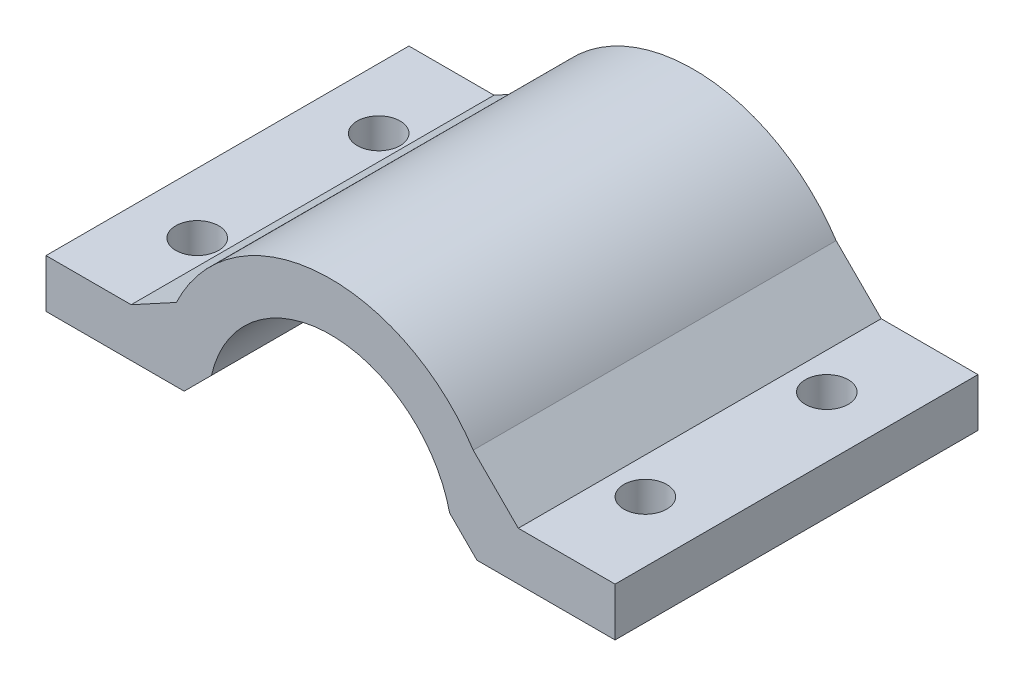
ISO-10303-21;
HEADER;
FILE_DESCRIPTION(('STEP AP214'),'2;1');
FILE_NAME('part.step','',(''),(''),'','','');
FILE_SCHEMA(('AUTOMOTIVE_DESIGN { 1 0 10303 214 1 1 1 1 }'));
ENDSEC;
DATA;
#1=APPLICATION_CONTEXT('core data for automotive mechanical design processes');
#2=APPLICATION_PROTOCOL_DEFINITION('international standard','automotive_design',2000,#1);
#3=PRODUCT_CONTEXT('',#1,'mechanical');
#4=PRODUCT('Part','Part','',(#3));
#5=PRODUCT_RELATED_PRODUCT_CATEGORY('part','',(#4));
#6=PRODUCT_DEFINITION_FORMATION('','',#4);
#7=PRODUCT_DEFINITION_CONTEXT('part definition',#1,'design');
#8=PRODUCT_DEFINITION('design','',#6,#7);
#9=PRODUCT_DEFINITION_SHAPE('','',#8);
#10=(LENGTH_UNIT() NAMED_UNIT(*) SI_UNIT(.MILLI.,.METRE.));
#11=(NAMED_UNIT(*) PLANE_ANGLE_UNIT() SI_UNIT($,.RADIAN.));
#12=(NAMED_UNIT(*) SI_UNIT($,.STERADIAN.) SOLID_ANGLE_UNIT());
#13=UNCERTAINTY_MEASURE_WITH_UNIT(LENGTH_MEASURE(1.E-05),#10,'distance_accuracy_value','');
#14=(GEOMETRIC_REPRESENTATION_CONTEXT(3) GLOBAL_UNCERTAINTY_ASSIGNED_CONTEXT((#13)) GLOBAL_UNIT_ASSIGNED_CONTEXT((#10,
#11,#12)) REPRESENTATION_CONTEXT('',''));
#15=CARTESIAN_POINT('',(0.,0.,0.));
#16=DIRECTION('',(0.,0.,1.));
#17=DIRECTION('',(1.,0.,0.));
#18=AXIS2_PLACEMENT_3D('',#15,#16,#17);
#19=CARTESIAN_POINT('',(0.,0.,38.1));
#20=DIRECTION('',(0.,1.,0.));
#21=DIRECTION('',(0.,0.,1.));
#22=AXIS2_PLACEMENT_3D('',#19,#20,#21);
#23=PLANE('',#22);
#24=CARTESIAN_POINT('',(6.35,0.,9.525));
#25=DIRECTION('',(0.,1.,0.));
#26=DIRECTION('',(0.,0.,1.));
#27=AXIS2_PLACEMENT_3D('',#24,#25,#26);
#28=CIRCLE('',#27,2.25);
#29=CARTESIAN_POINT('',(6.35,0.,11.775));
#30=VERTEX_POINT('',#29);
#31=EDGE_CURVE('E464',#30,#30,#28,.T.);
#32=ORIENTED_EDGE('',*,*,#31,.T.);
#33=EDGE_LOOP('',(#32));
#34=FACE_BOUND('',#33,.T.);
#35=DIRECTION('',(1.,0.,0.));
#36=VECTOR('',#35,1.);
#37=CARTESIAN_POINT('',(0.,0.,0.));
#38=LINE('',#37,#36);
#39=CARTESIAN_POINT('',(0.,0.,0.));
#40=VERTEX_POINT('',#39);
#41=CARTESIAN_POINT('',(14.5043205374543,0.,0.));
#42=VERTEX_POINT('',#41);
#43=EDGE_CURVE('E176',#40,#42,#38,.T.);
#44=ORIENTED_EDGE('',*,*,#43,.T.);
#45=DIRECTION('',(0.,0.,1.));
#46=VECTOR('',#45,1.);
#47=CARTESIAN_POINT('',(14.5043205374543,0.,38.1));
#48=LINE('',#47,#46);
#49=CARTESIAN_POINT('',(14.5043205374543,0.,38.1));
#50=VERTEX_POINT('',#49);
#51=EDGE_CURVE('E67',#42,#50,#48,.T.);
#52=ORIENTED_EDGE('',*,*,#51,.T.);
#53=DIRECTION('',(1.,0.,0.));
#54=VECTOR('',#53,1.);
#55=CARTESIAN_POINT('',(0.,0.,38.1));
#56=LINE('',#55,#54);
#57=CARTESIAN_POINT('',(0.,0.,38.1));
#58=VERTEX_POINT('',#57);
#59=EDGE_CURVE('E161',#58,#50,#56,.T.);
#60=ORIENTED_EDGE('',*,*,#59,.F.);
#61=DIRECTION('',(0.,0.,-1.));
#62=VECTOR('',#61,1.);
#63=CARTESIAN_POINT('',(0.,0.,38.1));
#64=LINE('',#63,#62);
#65=EDGE_CURVE('E175',#58,#40,#64,.T.);
#66=ORIENTED_EDGE('',*,*,#65,.T.);
#67=EDGE_LOOP('',(#44,#52,#60,#66));
#68=FACE_BOUND('',#67,.T.);
#69=CARTESIAN_POINT('',(6.35,0.,28.575));
#70=DIRECTION('',(0.,1.,0.));
#71=DIRECTION('',(0.,0.,1.));
#72=AXIS2_PLACEMENT_3D('',#69,#70,#71);
#73=CIRCLE('',#72,2.25);
#74=CARTESIAN_POINT('',(6.35,0.,30.825));
#75=VERTEX_POINT('',#74);
#76=EDGE_CURVE('E453',#75,#75,#73,.F.);
#77=ORIENTED_EDGE('',*,*,#76,.F.);
#78=EDGE_LOOP('',(#77));
#79=FACE_BOUND('',#78,.T.);
#80=ADVANCED_FACE('F43',(#34,#68,#79),#23,.F.);
#81=CARTESIAN_POINT('',(0.,0.,38.1));
#82=DIRECTION('',(0.,-1.,0.));
#83=DIRECTION('',(0.,0.,-1.));
#84=AXIS2_PLACEMENT_3D('',#81,#82,#83);
#85=PLANE('',#84);
#86=DIRECTION('',(-1.,0.,0.));
#87=VECTOR('',#86,1.);
#88=CARTESIAN_POINT('',(0.,0.,38.1));
#89=LINE('',#88,#87);
#90=CARTESIAN_POINT('',(59.7426410749086,0.,38.1));
#91=VERTEX_POINT('',#90);
#92=CARTESIAN_POINT('',(45.2383205374543,0.,38.1));
#93=VERTEX_POINT('',#92);
#94=EDGE_CURVE('E140',#91,#93,#89,.T.);
#95=ORIENTED_EDGE('',*,*,#94,.T.);
#96=DIRECTION('',(0.,0.,-1.));
#97=VECTOR('',#96,1.);
#98=CARTESIAN_POINT('',(45.2383205374543,0.,38.1));
#99=LINE('',#98,#97);
#100=CARTESIAN_POINT('',(45.2383205374543,0.,0.));
#101=VERTEX_POINT('',#100);
#102=EDGE_CURVE('E223',#93,#101,#99,.T.);
#103=ORIENTED_EDGE('',*,*,#102,.T.);
#104=DIRECTION('',(-1.,0.,0.));
#105=VECTOR('',#104,1.);
#106=CARTESIAN_POINT('',(0.,0.,0.));
#107=LINE('',#106,#105);
#108=CARTESIAN_POINT('',(59.7426410749086,0.,0.));
#109=VERTEX_POINT('',#108);
#110=EDGE_CURVE('E143',#109,#101,#107,.T.);
#111=ORIENTED_EDGE('',*,*,#110,.F.);
#112=DIRECTION('',(0.,0.,-1.));
#113=VECTOR('',#112,1.);
#114=CARTESIAN_POINT('',(59.7426410749086,0.,38.1));
#115=LINE('',#114,#113);
#116=EDGE_CURVE('E135',#91,#109,#115,.T.);
#117=ORIENTED_EDGE('',*,*,#116,.F.);
#118=EDGE_LOOP('',(#95,#103,#111,#117));
#119=FACE_BOUND('',#118,.T.);
#120=CARTESIAN_POINT('',(53.3926410749086,0.,28.575));
#121=DIRECTION('',(0.,1.,0.));
#122=DIRECTION('',(0.,0.,1.));
#123=AXIS2_PLACEMENT_3D('',#120,#121,#122);
#124=CIRCLE('',#123,2.25);
#125=CARTESIAN_POINT('',(53.3926410749086,0.,30.825));
#126=VERTEX_POINT('',#125);
#127=EDGE_CURVE('E179',#126,#126,#124,.T.);
#128=ORIENTED_EDGE('',*,*,#127,.T.);
#129=EDGE_LOOP('',(#128));
#130=FACE_BOUND('',#129,.T.);
#131=CARTESIAN_POINT('',(53.3926410749086,0.,9.52499999999999));
#132=DIRECTION('',(0.,1.,0.));
#133=DIRECTION('',(0.,0.,1.));
#134=AXIS2_PLACEMENT_3D('',#131,#132,#133);
#135=CIRCLE('',#134,2.25);
#136=CARTESIAN_POINT('',(53.3926410749086,0.,11.775));
#137=VERTEX_POINT('',#136);
#138=EDGE_CURVE('E449',#137,#137,#135,.F.);
#139=ORIENTED_EDGE('',*,*,#138,.F.);
#140=EDGE_LOOP('',(#139));
#141=FACE_BOUND('',#140,.T.);
#142=ADVANCED_FACE('F137',(#119,#130,#141),#85,.T.);
#143=CARTESIAN_POINT('',(0.,5.08,38.1));
#144=DIRECTION('',(0.,-1.,0.));
#145=DIRECTION('',(0.,0.,-1.));
#146=AXIS2_PLACEMENT_3D('',#143,#144,#145);
#147=PLANE('',#146);
#148=CARTESIAN_POINT('',(53.3926410749086,5.08,28.575));
#149=DIRECTION('',(0.,1.,0.));
#150=DIRECTION('',(0.,0.,1.));
#151=AXIS2_PLACEMENT_3D('',#148,#149,#150);
#152=CIRCLE('',#151,2.25);
#153=CARTESIAN_POINT('',(53.3926410749086,5.08,30.825));
#154=VERTEX_POINT('',#153);
#155=EDGE_CURVE('E455',#154,#154,#152,.T.);
#156=ORIENTED_EDGE('',*,*,#155,.F.);
#157=EDGE_LOOP('',(#156));
#158=FACE_BOUND('',#157,.T.);
#159=DIRECTION('',(-1.,0.,0.));
#160=VECTOR('',#159,1.);
#161=CARTESIAN_POINT('',(0.,5.08,0.));
#162=LINE('',#161,#160);
#163=CARTESIAN_POINT('',(59.7426410749086,5.08,0.));
#164=VERTEX_POINT('',#163);
#165=CARTESIAN_POINT('',(49.5826410749086,5.08,0.));
#166=VERTEX_POINT('',#165);
#167=EDGE_CURVE('E185',#164,#166,#162,.T.);
#168=ORIENTED_EDGE('',*,*,#167,.T.);
#169=DIRECTION('',(0.,0.,1.));
#170=VECTOR('',#169,1.);
#171=CARTESIAN_POINT('',(49.5826410749086,5.08,38.1));
#172=LINE('',#171,#170);
#173=CARTESIAN_POINT('',(49.5826410749086,5.08,38.1));
#174=VERTEX_POINT('',#173);
#175=EDGE_CURVE('E208',#166,#174,#172,.T.);
#176=ORIENTED_EDGE('',*,*,#175,.T.);
#177=DIRECTION('',(-1.,0.,0.));
#178=VECTOR('',#177,1.);
#179=CARTESIAN_POINT('',(0.,5.08,38.1));
#180=LINE('',#179,#178);
#181=CARTESIAN_POINT('',(59.7426410749086,5.08,38.1));
#182=VERTEX_POINT('',#181);
#183=EDGE_CURVE('E155',#182,#174,#180,.T.);
#184=ORIENTED_EDGE('',*,*,#183,.F.);
#185=DIRECTION('',(0.,0.,-1.));
#186=VECTOR('',#185,1.);
#187=CARTESIAN_POINT('',(59.7426410749086,5.08,38.1));
#188=LINE('',#187,#186);
#189=EDGE_CURVE('E147',#182,#164,#188,.T.);
#190=ORIENTED_EDGE('',*,*,#189,.T.);
#191=EDGE_LOOP('',(#168,#176,#184,#190));
#192=FACE_BOUND('',#191,.T.);
#193=CARTESIAN_POINT('',(53.3926410749086,5.08,9.52499999999999));
#194=DIRECTION('',(0.,1.,0.));
#195=DIRECTION('',(0.,0.,1.));
#196=AXIS2_PLACEMENT_3D('',#193,#194,#195);
#197=CIRCLE('',#196,2.25);
#198=CARTESIAN_POINT('',(53.3926410749086,5.08,11.775));
#199=VERTEX_POINT('',#198);
#200=EDGE_CURVE('E452',#199,#199,#197,.F.);
#201=ORIENTED_EDGE('',*,*,#200,.T.);
#202=EDGE_LOOP('',(#201));
#203=FACE_BOUND('',#202,.T.);
#204=ADVANCED_FACE('F236',(#158,#192,#203),#147,.F.);
#205=CARTESIAN_POINT('',(0.,5.08,38.1));
#206=DIRECTION('',(0.,1.,0.));
#207=DIRECTION('',(0.,0.,1.));
#208=AXIS2_PLACEMENT_3D('',#205,#206,#207);
#209=PLANE('',#208);
#210=DIRECTION('',(1.,0.,0.));
#211=VECTOR('',#210,1.);
#212=CARTESIAN_POINT('',(0.,5.08,38.1));
#213=LINE('',#212,#211);
#214=CARTESIAN_POINT('',(0.,5.08,38.1));
#215=VERTEX_POINT('',#214);
#216=CARTESIAN_POINT('',(8.93831161707201,5.08,38.1));
#217=VERTEX_POINT('',#216);
#218=EDGE_CURVE('E169',#215,#217,#213,.T.);
#219=ORIENTED_EDGE('',*,*,#218,.T.);
#220=DIRECTION('',(0.,0.,-1.));
#221=VECTOR('',#220,1.);
#222=CARTESIAN_POINT('',(8.93831161707201,5.08,38.1));
#223=LINE('',#222,#221);
#224=CARTESIAN_POINT('',(8.93831161707204,5.08,0.));
#225=VERTEX_POINT('',#224);
#226=EDGE_CURVE('E146',#217,#225,#223,.T.);
#227=ORIENTED_EDGE('',*,*,#226,.T.);
#228=DIRECTION('',(1.,0.,0.));
#229=VECTOR('',#228,1.);
#230=CARTESIAN_POINT('',(0.,5.08,0.));
#231=LINE('',#230,#229);
#232=CARTESIAN_POINT('',(0.,5.08,0.));
#233=VERTEX_POINT('',#232);
#234=EDGE_CURVE('E191',#233,#225,#231,.T.);
#235=ORIENTED_EDGE('',*,*,#234,.F.);
#236=DIRECTION('',(0.,0.,-1.));
#237=VECTOR('',#236,1.);
#238=CARTESIAN_POINT('',(0.,5.08,38.1));
#239=LINE('',#238,#237);
#240=EDGE_CURVE('E198',#215,#233,#239,.T.);
#241=ORIENTED_EDGE('',*,*,#240,.F.);
#242=EDGE_LOOP('',(#219,#227,#235,#241));
#243=FACE_BOUND('',#242,.T.);
#244=CARTESIAN_POINT('',(6.35,5.08,9.525));
#245=DIRECTION('',(0.,1.,0.));
#246=DIRECTION('',(0.,0.,1.));
#247=AXIS2_PLACEMENT_3D('',#244,#245,#246);
#248=CIRCLE('',#247,2.25);
#249=CARTESIAN_POINT('',(6.35,5.08,11.775));
#250=VERTEX_POINT('',#249);
#251=EDGE_CURVE('E474',#250,#250,#248,.T.);
#252=ORIENTED_EDGE('',*,*,#251,.F.);
#253=EDGE_LOOP('',(#252));
#254=FACE_BOUND('',#253,.T.);
#255=CARTESIAN_POINT('',(6.35,5.08,28.575));
#256=DIRECTION('',(0.,1.,0.));
#257=DIRECTION('',(0.,0.,1.));
#258=AXIS2_PLACEMENT_3D('',#255,#256,#257);
#259=CIRCLE('',#258,2.25);
#260=CARTESIAN_POINT('',(6.35,5.08,30.825));
#261=VERTEX_POINT('',#260);
#262=EDGE_CURVE('E458',#261,#261,#259,.F.);
#263=ORIENTED_EDGE('',*,*,#262,.T.);
#264=EDGE_LOOP('',(#263));
#265=FACE_BOUND('',#264,.T.);
#266=ADVANCED_FACE('F251',(#243,#254,#265),#209,.T.);
#267=CARTESIAN_POINT('',(29.8713205374543,0.,38.1));
#268=DIRECTION('',(0.,0.,-1.));
#269=DIRECTION('',(-1.,0.,0.));
#270=AXIS2_PLACEMENT_3D('',#267,#268,#269);
#271=CYLINDRICAL_SURFACE('',#270,12.827);
#272=CARTESIAN_POINT('',(29.8713205374543,0.,38.1));
#273=DIRECTION('',(0.,0.,1.));
#274=DIRECTION('',(1.,0.,0.));
#275=AXIS2_PLACEMENT_3D('',#272,#273,#274);
#276=CIRCLE('',#275,12.827);
#277=CARTESIAN_POINT('',(42.3745500163774,2.86377052107693,38.1));
#278=VERTEX_POINT('',#277);
#279=CARTESIAN_POINT('',(17.3680910585312,2.86377052107694,38.1));
#280=VERTEX_POINT('',#279);
#281=EDGE_CURVE('E158',#278,#280,#276,.T.);
#282=ORIENTED_EDGE('',*,*,#281,.T.);
#283=DIRECTION('',(0.,0.,-1.));
#284=VECTOR('',#283,1.);
#285=CARTESIAN_POINT('',(17.3680910585312,2.86377052107694,38.1));
#286=LINE('',#285,#284);
#287=CARTESIAN_POINT('',(17.3680910585312,2.86377052107695,0.));
#288=VERTEX_POINT('',#287);
#289=EDGE_CURVE('E212',#280,#288,#286,.T.);
#290=ORIENTED_EDGE('',*,*,#289,.T.);
#291=CARTESIAN_POINT('',(29.8713205374543,0.,0.));
#292=DIRECTION('',(0.,0.,1.));
#293=DIRECTION('',(1.,0.,0.));
#294=AXIS2_PLACEMENT_3D('',#291,#292,#293);
#295=CIRCLE('',#294,12.827);
#296=CARTESIAN_POINT('',(42.3745500163774,2.86377052107693,0.));
#297=VERTEX_POINT('',#296);
#298=EDGE_CURVE('E178',#297,#288,#295,.T.);
#299=ORIENTED_EDGE('',*,*,#298,.F.);
#300=DIRECTION('',(0.,0.,-1.));
#301=VECTOR('',#300,1.);
#302=CARTESIAN_POINT('',(42.3745500163774,2.86377052107693,38.1));
#303=LINE('',#302,#301);
#304=EDGE_CURVE('E210',#297,#278,#303,.F.);
#305=ORIENTED_EDGE('',*,*,#304,.T.);
#306=EDGE_LOOP('',(#282,#290,#299,#305));
#307=FACE_BOUND('',#306,.T.);
#308=ADVANCED_FACE('F263',(#307),#271,.F.);
#309=CARTESIAN_POINT('',(59.7426410749086,0.,38.1));
#310=DIRECTION('',(-1.,0.,0.));
#311=DIRECTION('',(0.,0.,1.));
#312=AXIS2_PLACEMENT_3D('',#309,#310,#311);
#313=PLANE('',#312);
#314=DIRECTION('',(0.,1.,0.));
#315=VECTOR('',#314,1.);
#316=CARTESIAN_POINT('',(59.7426410749086,0.,0.));
#317=LINE('',#316,#315);
#318=EDGE_CURVE('E183',#109,#164,#317,.T.);
#319=ORIENTED_EDGE('',*,*,#318,.T.);
#320=ORIENTED_EDGE('',*,*,#189,.F.);
#321=DIRECTION('',(0.,1.,0.));
#322=VECTOR('',#321,1.);
#323=CARTESIAN_POINT('',(59.7426410749086,0.,38.1));
#324=LINE('',#323,#322);
#325=EDGE_CURVE('E150',#91,#182,#324,.T.);
#326=ORIENTED_EDGE('',*,*,#325,.F.);
#327=ORIENTED_EDGE('',*,*,#116,.T.);
#328=EDGE_LOOP('',(#319,#320,#326,#327));
#329=FACE_BOUND('',#328,.T.);
#330=ADVANCED_FACE('F151',(#329),#313,.F.);
#331=CARTESIAN_POINT('',(29.8713205374543,0.,38.1));
#332=DIRECTION('',(0.,0.,-1.));
#333=DIRECTION('',(-1.,0.,0.));
#334=AXIS2_PLACEMENT_3D('',#331,#332,#333);
#335=CYLINDRICAL_SURFACE('',#334,17.907);
#336=CARTESIAN_POINT('',(29.8713205374543,0.,0.));
#337=DIRECTION('',(0.,0.,1.));
#338=DIRECTION('',(1.,0.,0.));
#339=AXIS2_PLACEMENT_3D('',#336,#337,#338);
#340=CIRCLE('',#339,17.907);
#341=CARTESIAN_POINT('',(44.8511501122252,9.81149096268341,0.));
#342=VERTEX_POINT('',#341);
#343=CARTESIAN_POINT('',(13.685075655568,7.65938154315409,0.));
#344=VERTEX_POINT('',#343);
#345=EDGE_CURVE('E188',#342,#344,#340,.T.);
#346=ORIENTED_EDGE('',*,*,#345,.T.);
#347=DIRECTION('',(0.,0.,-1.));
#348=VECTOR('',#347,1.);
#349=CARTESIAN_POINT('',(13.685075655568,7.65938154315408,38.1));
#350=LINE('',#349,#348);
#351=CARTESIAN_POINT('',(13.685075655568,7.65938154315409,38.1));
#352=VERTEX_POINT('',#351);
#353=EDGE_CURVE('E206',#344,#352,#350,.F.);
#354=ORIENTED_EDGE('',*,*,#353,.T.);
#355=CARTESIAN_POINT('',(29.8713205374543,0.,38.1));
#356=DIRECTION('',(0.,0.,1.));
#357=DIRECTION('',(1.,0.,0.));
#358=AXIS2_PLACEMENT_3D('',#355,#356,#357);
#359=CIRCLE('',#358,17.907);
#360=CARTESIAN_POINT('',(44.8511501122252,9.81149096268339,38.1));
#361=VERTEX_POINT('',#360);
#362=EDGE_CURVE('E166',#361,#352,#359,.T.);
#363=ORIENTED_EDGE('',*,*,#362,.F.);
#364=DIRECTION('',(0.,0.,-1.));
#365=VECTOR('',#364,1.);
#366=CARTESIAN_POINT('',(44.8511501122252,9.81149096268339,38.1));
#367=LINE('',#366,#365);
#368=EDGE_CURVE('E203',#361,#342,#367,.T.);
#369=ORIENTED_EDGE('',*,*,#368,.T.);
#370=EDGE_LOOP('',(#346,#354,#363,#369));
#371=FACE_BOUND('',#370,.T.);
#372=ADVANCED_FACE('F243',(#371),#335,.T.);
#373=CARTESIAN_POINT('',(0.,0.,38.1));
#374=DIRECTION('',(-1.,0.,0.));
#375=DIRECTION('',(0.,0.,1.));
#376=AXIS2_PLACEMENT_3D('',#373,#374,#375);
#377=PLANE('',#376);
#378=DIRECTION('',(0.,1.,0.));
#379=VECTOR('',#378,1.);
#380=CARTESIAN_POINT('',(0.,0.,0.));
#381=LINE('',#380,#379);
#382=EDGE_CURVE('E194',#40,#233,#381,.T.);
#383=ORIENTED_EDGE('',*,*,#382,.F.);
#384=ORIENTED_EDGE('',*,*,#65,.F.);
#385=DIRECTION('',(0.,1.,0.));
#386=VECTOR('',#385,1.);
#387=CARTESIAN_POINT('',(0.,0.,38.1));
#388=LINE('',#387,#386);
#389=EDGE_CURVE('E172',#58,#215,#388,.T.);
#390=ORIENTED_EDGE('',*,*,#389,.T.);
#391=ORIENTED_EDGE('',*,*,#240,.T.);
#392=EDGE_LOOP('',(#383,#384,#390,#391));
#393=FACE_BOUND('',#392,.T.);
#394=ADVANCED_FACE('F256',(#393),#377,.T.);
#395=CARTESIAN_POINT('',(0.,0.,38.1));
#396=DIRECTION('',(0.,0.,1.));
#397=DIRECTION('',(1.,0.,0.));
#398=AXIS2_PLACEMENT_3D('',#395,#396,#397);
#399=PLANE('',#398);
#400=ORIENTED_EDGE('',*,*,#59,.T.);
#401=DIRECTION('',(-0.707106781186548,-0.707106781186547,0.));
#402=VECTOR('',#401,1.);
#403=CARTESIAN_POINT('',(7.25216026872713,-7.25216026872714,38.1));
#404=LINE('',#403,#402);
#405=EDGE_CURVE('E221',#50,#280,#404,.F.);
#406=ORIENTED_EDGE('',*,*,#405,.T.);
#407=ORIENTED_EDGE('',*,*,#281,.F.);
#408=DIRECTION('',(-0.707106781186546,0.707106781186549,0.));
#409=VECTOR('',#408,1.);
#410=CARTESIAN_POINT('',(22.6191602687273,22.6191602687271,38.1));
#411=LINE('',#410,#409);
#412=EDGE_CURVE('E59',#278,#93,#411,.F.);
#413=ORIENTED_EDGE('',*,*,#412,.T.);
#414=ORIENTED_EDGE('',*,*,#94,.F.);
#415=ORIENTED_EDGE('',*,*,#325,.T.);
#416=ORIENTED_EDGE('',*,*,#183,.T.);
#417=DIRECTION('',(-0.707106781186544,0.707106781186551,0.));
#418=VECTOR('',#417,1.);
#419=CARTESIAN_POINT('',(44.8511501122252,9.81149096268343,38.1));
#420=LINE('',#419,#418);
#421=EDGE_CURVE('E11',#174,#361,#420,.T.);
#422=ORIENTED_EDGE('',*,*,#421,.T.);
#423=ORIENTED_EDGE('',*,*,#362,.T.);
#424=DIRECTION('',(-0.878654137621572,-0.477458800778133,0.));
#425=VECTOR('',#424,1.);
#426=CARTESIAN_POINT('',(8.93831161707204,5.08,38.1));
#427=LINE('',#426,#425);
#428=EDGE_CURVE('E227',#352,#217,#427,.T.);
#429=ORIENTED_EDGE('',*,*,#428,.T.);
#430=ORIENTED_EDGE('',*,*,#218,.F.);
#431=ORIENTED_EDGE('',*,*,#389,.F.);
#432=EDGE_LOOP('',(#400,#406,#407,#413,#414,#415,#416,#422,#423,#429,#430,#431));
#433=FACE_BOUND('',#432,.T.);
#434=ADVANCED_FACE('F157',(#433),#399,.T.);
#435=CARTESIAN_POINT('',(0.,0.,0.));
#436=DIRECTION('',(0.,0.,1.));
#437=DIRECTION('',(1.,0.,0.));
#438=AXIS2_PLACEMENT_3D('',#435,#436,#437);
#439=PLANE('',#438);
#440=ORIENTED_EDGE('',*,*,#298,.T.);
#441=DIRECTION('',(0.707106781186548,0.707106781186547,0.));
#442=VECTOR('',#441,1.);
#443=CARTESIAN_POINT('',(17.3680910585312,2.86377052107696,0.));
#444=LINE('',#443,#442);
#445=EDGE_CURVE('E217',#288,#42,#444,.F.);
#446=ORIENTED_EDGE('',*,*,#445,.T.);
#447=ORIENTED_EDGE('',*,*,#43,.F.);
#448=ORIENTED_EDGE('',*,*,#382,.T.);
#449=ORIENTED_EDGE('',*,*,#234,.T.);
#450=DIRECTION('',(0.878654137621572,0.477458800778133,0.));
#451=VECTOR('',#450,1.);
#452=CARTESIAN_POINT('',(-0.093528198160473,0.172117339054301,0.));
#453=LINE('',#452,#451);
#454=EDGE_CURVE('E225',#225,#344,#453,.T.);
#455=ORIENTED_EDGE('',*,*,#454,.T.);
#456=ORIENTED_EDGE('',*,*,#345,.F.);
#457=DIRECTION('',(0.707106781186544,-0.707106781186551,0.));
#458=VECTOR('',#457,1.);
#459=CARTESIAN_POINT('',(27.3313205374545,27.3313205374543,0.));
#460=LINE('',#459,#458);
#461=EDGE_CURVE('E52',#342,#166,#460,.T.);
#462=ORIENTED_EDGE('',*,*,#461,.T.);
#463=ORIENTED_EDGE('',*,*,#167,.F.);
#464=ORIENTED_EDGE('',*,*,#318,.F.);
#465=ORIENTED_EDGE('',*,*,#110,.T.);
#466=DIRECTION('',(0.707106781186546,-0.707106781186549,0.));
#467=VECTOR('',#466,1.);
#468=CARTESIAN_POINT('',(45.2383205374543,0.,0.));
#469=LINE('',#468,#467);
#470=EDGE_CURVE('E215',#101,#297,#469,.F.);
#471=ORIENTED_EDGE('',*,*,#470,.T.);
#472=EDGE_LOOP('',(#440,#446,#447,#448,#449,#455,#456,#462,#463,#464,#465,#471));
#473=FACE_BOUND('',#472,.T.);
#474=ADVANCED_FACE('F231',(#473),#439,.F.);
#475=CARTESIAN_POINT('',(8.93831161707204,5.08,38.1));
#476=DIRECTION('',(0.477458800778133,-0.878654137621572,0.));
#477=DIRECTION('',(0.,0.,-1.));
#478=AXIS2_PLACEMENT_3D('',#475,#476,#477);
#479=PLANE('',#478);
#480=ORIENTED_EDGE('',*,*,#428,.F.);
#481=ORIENTED_EDGE('',*,*,#353,.F.);
#482=ORIENTED_EDGE('',*,*,#454,.F.);
#483=ORIENTED_EDGE('',*,*,#226,.F.);
#484=EDGE_LOOP('',(#480,#481,#482,#483));
#485=FACE_BOUND('',#484,.T.);
#486=ADVANCED_FACE('F246',(#485),#479,.F.);
#487=CARTESIAN_POINT('',(44.8511501122252,9.81149096268343,38.1));
#488=DIRECTION('',(-0.707106781186551,-0.707106781186544,0.));
#489=DIRECTION('',(0.,0.,-1.));
#490=AXIS2_PLACEMENT_3D('',#487,#488,#489);
#491=PLANE('',#490);
#492=ORIENTED_EDGE('',*,*,#421,.F.);
#493=ORIENTED_EDGE('',*,*,#175,.F.);
#494=ORIENTED_EDGE('',*,*,#461,.F.);
#495=ORIENTED_EDGE('',*,*,#368,.F.);
#496=EDGE_LOOP('',(#492,#493,#494,#495));
#497=FACE_BOUND('',#496,.T.);
#498=ADVANCED_FACE('F239',(#497),#491,.F.);
#499=CARTESIAN_POINT('',(17.3680910585312,2.86377052107696,38.1));
#500=DIRECTION('',(-0.707106781186547,0.707106781186548,0.));
#501=DIRECTION('',(0.,0.,-1.));
#502=AXIS2_PLACEMENT_3D('',#499,#500,#501);
#503=PLANE('',#502);
#504=ORIENTED_EDGE('',*,*,#405,.F.);
#505=ORIENTED_EDGE('',*,*,#51,.F.);
#506=ORIENTED_EDGE('',*,*,#445,.F.);
#507=ORIENTED_EDGE('',*,*,#289,.F.);
#508=EDGE_LOOP('',(#504,#505,#506,#507));
#509=FACE_BOUND('',#508,.T.);
#510=ADVANCED_FACE('F260',(#509),#503,.F.);
#511=CARTESIAN_POINT('',(45.2383205374543,0.,38.1));
#512=DIRECTION('',(0.707106781186549,0.707106781186545,0.));
#513=DIRECTION('',(0.,0.,-1.));
#514=AXIS2_PLACEMENT_3D('',#511,#512,#513);
#515=PLANE('',#514);
#516=ORIENTED_EDGE('',*,*,#412,.F.);
#517=ORIENTED_EDGE('',*,*,#304,.F.);
#518=ORIENTED_EDGE('',*,*,#470,.F.);
#519=ORIENTED_EDGE('',*,*,#102,.F.);
#520=EDGE_LOOP('',(#516,#517,#518,#519));
#521=FACE_BOUND('',#520,.T.);
#522=ADVANCED_FACE('F46',(#521),#515,.F.);
#523=CARTESIAN_POINT('',(6.35,0.,9.525));
#524=DIRECTION('',(0.,1.,0.));
#525=DIRECTION('',(0.,0.,1.));
#526=AXIS2_PLACEMENT_3D('',#523,#524,#525);
#527=CYLINDRICAL_SURFACE('',#526,2.25);
#528=ORIENTED_EDGE('',*,*,#31,.F.);
#529=EDGE_LOOP('',(#528));
#530=FACE_BOUND('',#529,.T.);
#531=ORIENTED_EDGE('',*,*,#251,.T.);
#532=EDGE_LOOP('',(#531));
#533=FACE_BOUND('',#532,.T.);
#534=ADVANCED_FACE('F268',(#530,#533),#527,.F.);
#535=CARTESIAN_POINT('',(6.35,0.,28.575));
#536=DIRECTION('',(0.,1.,0.));
#537=DIRECTION('',(0.,0.,1.));
#538=AXIS2_PLACEMENT_3D('',#535,#536,#537);
#539=CYLINDRICAL_SURFACE('',#538,2.25);
#540=ORIENTED_EDGE('',*,*,#76,.T.);
#541=EDGE_LOOP('',(#540));
#542=FACE_BOUND('',#541,.T.);
#543=ORIENTED_EDGE('',*,*,#262,.F.);
#544=EDGE_LOOP('',(#543));
#545=FACE_BOUND('',#544,.T.);
#546=ADVANCED_FACE('F274',(#542,#545),#539,.F.);
#547=CARTESIAN_POINT('',(53.3926410749086,0.,28.575));
#548=DIRECTION('',(0.,1.,0.));
#549=DIRECTION('',(0.,0.,1.));
#550=AXIS2_PLACEMENT_3D('',#547,#548,#549);
#551=CYLINDRICAL_SURFACE('',#550,2.25);
#552=ORIENTED_EDGE('',*,*,#127,.F.);
#553=EDGE_LOOP('',(#552));
#554=FACE_BOUND('',#553,.T.);
#555=ORIENTED_EDGE('',*,*,#155,.T.);
#556=EDGE_LOOP('',(#555));
#557=FACE_BOUND('',#556,.T.);
#558=ADVANCED_FACE('F354',(#554,#557),#551,.F.);
#559=CARTESIAN_POINT('',(53.3926410749086,0.,9.52499999999999));
#560=DIRECTION('',(0.,1.,0.));
#561=DIRECTION('',(0.,0.,1.));
#562=AXIS2_PLACEMENT_3D('',#559,#560,#561);
#563=CYLINDRICAL_SURFACE('',#562,2.25);
#564=ORIENTED_EDGE('',*,*,#138,.T.);
#565=EDGE_LOOP('',(#564));
#566=FACE_BOUND('',#565,.T.);
#567=ORIENTED_EDGE('',*,*,#200,.F.);
#568=EDGE_LOOP('',(#567));
#569=FACE_BOUND('',#568,.T.);
#570=ADVANCED_FACE('F364',(#566,#569),#563,.F.);
#571=CLOSED_SHELL('',(#80,#142,#204,#266,#308,#330,#372,#394,#434,#474,#486,#498,#510,#522,#534,
#546,#558,#570));
#572=MANIFOLD_SOLID_BREP('B2',#571);
#573=ADVANCED_BREP_SHAPE_REPRESENTATION('',(#18,#572),#14);
#574=SHAPE_DEFINITION_REPRESENTATION(#9,#573);
ENDSEC;
END-ISO-10303-21;
